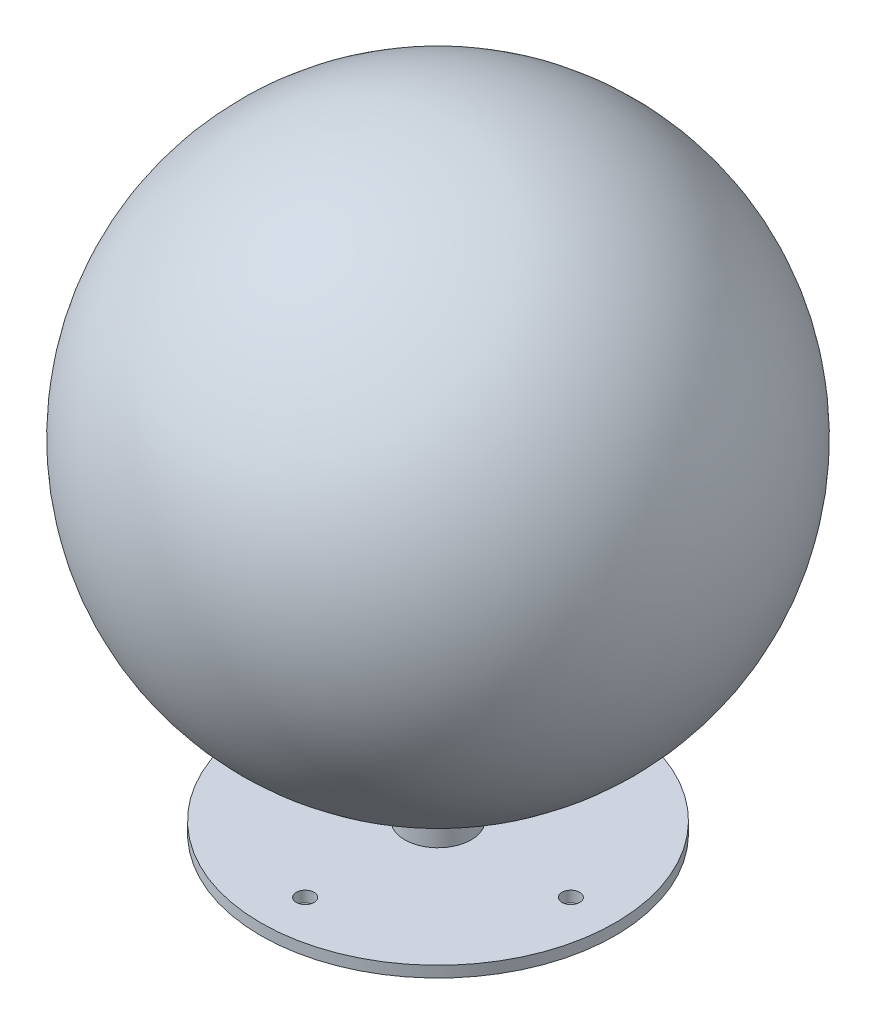
ISO-10303-21;
HEADER;
FILE_DESCRIPTION(('STEP AP214'),'2;1');
FILE_NAME('part.step','',(''),(''),'','','');
FILE_SCHEMA(('AUTOMOTIVE_DESIGN { 1 0 10303 214 1 1 1 1 }'));
ENDSEC;
DATA;
#1=APPLICATION_CONTEXT('core data for automotive mechanical design processes');
#2=APPLICATION_PROTOCOL_DEFINITION('international standard','automotive_design',2000,#1);
#3=PRODUCT_CONTEXT('',#1,'mechanical');
#4=PRODUCT('Part','Part','',(#3));
#5=PRODUCT_RELATED_PRODUCT_CATEGORY('part','',(#4));
#6=PRODUCT_DEFINITION_FORMATION('','',#4);
#7=PRODUCT_DEFINITION_CONTEXT('part definition',#1,'design');
#8=PRODUCT_DEFINITION('design','',#6,#7);
#9=PRODUCT_DEFINITION_SHAPE('','',#8);
#10=(LENGTH_UNIT() NAMED_UNIT(*) SI_UNIT(.MILLI.,.METRE.));
#11=(NAMED_UNIT(*) PLANE_ANGLE_UNIT() SI_UNIT($,.RADIAN.));
#12=(NAMED_UNIT(*) SI_UNIT($,.STERADIAN.) SOLID_ANGLE_UNIT());
#13=UNCERTAINTY_MEASURE_WITH_UNIT(LENGTH_MEASURE(1.E-05),#10,'distance_accuracy_value','');
#14=(GEOMETRIC_REPRESENTATION_CONTEXT(3) GLOBAL_UNCERTAINTY_ASSIGNED_CONTEXT((#13)) GLOBAL_UNIT_ASSIGNED_CONTEXT((#10,
#11,#12)) REPRESENTATION_CONTEXT('',''));
#15=CARTESIAN_POINT('',(0.,0.,0.));
#16=DIRECTION('',(0.,0.,1.));
#17=DIRECTION('',(1.,0.,0.));
#18=AXIS2_PLACEMENT_3D('',#15,#16,#17);
#19=CARTESIAN_POINT('',(0.,5.,0.));
#20=DIRECTION('',(0.,-1.,0.));
#21=DIRECTION('',(0.,0.,-1.));
#22=AXIS2_PLACEMENT_3D('',#19,#20,#21);
#23=CYLINDRICAL_SURFACE('',#22,15.);
#24=CARTESIAN_POINT('',(0.,5.,0.));
#25=DIRECTION('',(0.,1.,0.));
#26=DIRECTION('',(0.,0.,1.));
#27=AXIS2_PLACEMENT_3D('',#24,#25,#26);
#28=CIRCLE('',#27,15.);
#29=CARTESIAN_POINT('',(0.,5.,15.));
#30=VERTEX_POINT('',#29);
#31=EDGE_CURVE('E10',#30,#30,#28,.T.);
#32=ORIENTED_EDGE('',*,*,#31,.T.);
#33=EDGE_LOOP('',(#32));
#34=FACE_BOUND('',#33,.T.);
#35=CARTESIAN_POINT('',(0.,30.9032635400915,0.));
#36=DIRECTION('',(0.,1.,0.));
#37=DIRECTION('',(0.,0.,1.));
#38=AXIS2_PLACEMENT_3D('',#35,#36,#37);
#39=CIRCLE('',#38,15.);
#40=CARTESIAN_POINT('',(0.,30.9032635400915,15.));
#41=VERTEX_POINT('',#40);
#42=EDGE_CURVE('E37',#41,#41,#39,.F.);
#43=ORIENTED_EDGE('',*,*,#42,.T.);
#44=EDGE_LOOP('',(#43));
#45=FACE_BOUND('',#44,.T.);
#46=ADVANCED_FACE('F33',(#34,#45),#23,.T.);
#47=CARTESIAN_POINT('',(0.,5.,0.));
#48=DIRECTION('',(0.,-1.,0.));
#49=DIRECTION('',(0.,0.,-1.));
#50=AXIS2_PLACEMENT_3D('',#47,#48,#49);
#51=CYLINDRICAL_SURFACE('',#50,80.);
#52=CARTESIAN_POINT('',(0.,5.,0.));
#53=DIRECTION('',(0.,1.,0.));
#54=DIRECTION('',(0.,0.,1.));
#55=AXIS2_PLACEMENT_3D('',#52,#53,#54);
#56=CIRCLE('',#55,80.);
#57=CARTESIAN_POINT('',(0.,5.,80.));
#58=VERTEX_POINT('',#57);
#59=EDGE_CURVE('E41',#58,#58,#56,.T.);
#60=ORIENTED_EDGE('',*,*,#59,.F.);
#61=EDGE_LOOP('',(#60));
#62=FACE_BOUND('',#61,.T.);
#63=CARTESIAN_POINT('',(0.,0.,0.));
#64=DIRECTION('',(0.,1.,0.));
#65=DIRECTION('',(0.,0.,1.));
#66=AXIS2_PLACEMENT_3D('',#63,#64,#65);
#67=CIRCLE('',#66,80.);
#68=CARTESIAN_POINT('',(0.,0.,80.));
#69=VERTEX_POINT('',#68);
#70=EDGE_CURVE('E45',#69,#69,#67,.T.);
#71=ORIENTED_EDGE('',*,*,#70,.T.);
#72=EDGE_LOOP('',(#71));
#73=FACE_BOUND('',#72,.T.);
#74=ADVANCED_FACE('F35',(#62,#73),#51,.T.);
#75=CARTESIAN_POINT('',(0.,5.,0.));
#76=DIRECTION('',(0.,1.,0.));
#77=DIRECTION('',(0.,0.,1.));
#78=AXIS2_PLACEMENT_3D('',#75,#76,#77);
#79=PLANE('',#78);
#80=ORIENTED_EDGE('',*,*,#31,.F.);
#81=EDGE_LOOP('',(#80));
#82=FACE_BOUND('',#81,.T.);
#83=CARTESIAN_POINT('',(0.,5.,-60.));
#84=DIRECTION('',(0.,1.,0.));
#85=DIRECTION('',(0.,0.,1.));
#86=AXIS2_PLACEMENT_3D('',#83,#84,#85);
#87=CIRCLE('',#86,3.99999999999999);
#88=CARTESIAN_POINT('',(0.,5.,-56.));
#89=VERTEX_POINT('',#88);
#90=EDGE_CURVE('E52',#89,#89,#87,.T.);
#91=ORIENTED_EDGE('',*,*,#90,.F.);
#92=EDGE_LOOP('',(#91));
#93=FACE_BOUND('',#92,.T.);
#94=CARTESIAN_POINT('',(-60.,5.,0.));
#95=DIRECTION('',(0.,1.,0.));
#96=DIRECTION('',(0.,0.,1.));
#97=AXIS2_PLACEMENT_3D('',#94,#95,#96);
#98=CIRCLE('',#97,3.99999999999999);
#99=CARTESIAN_POINT('',(-60.,5.,3.99999999999999));
#100=VERTEX_POINT('',#99);
#101=EDGE_CURVE('E51',#100,#100,#98,.T.);
#102=ORIENTED_EDGE('',*,*,#101,.F.);
#103=EDGE_LOOP('',(#102));
#104=FACE_BOUND('',#103,.T.);
#105=CARTESIAN_POINT('',(60.,5.,0.));
#106=DIRECTION('',(0.,1.,0.));
#107=DIRECTION('',(0.,0.,1.));
#108=AXIS2_PLACEMENT_3D('',#105,#106,#107);
#109=CIRCLE('',#108,3.99999999999999);
#110=CARTESIAN_POINT('',(60.,5.,3.99999999999999));
#111=VERTEX_POINT('',#110);
#112=EDGE_CURVE('E56',#111,#111,#109,.T.);
#113=ORIENTED_EDGE('',*,*,#112,.F.);
#114=EDGE_LOOP('',(#113));
#115=FACE_BOUND('',#114,.T.);
#116=CARTESIAN_POINT('',(0.,5.,60.));
#117=DIRECTION('',(0.,1.,0.));
#118=DIRECTION('',(0.,0.,1.));
#119=AXIS2_PLACEMENT_3D('',#116,#117,#118);
#120=CIRCLE('',#119,3.99999999999999);
#121=CARTESIAN_POINT('',(0.,5.,64.));
#122=VERTEX_POINT('',#121);
#123=EDGE_CURVE('E62',#122,#122,#120,.T.);
#124=ORIENTED_EDGE('',*,*,#123,.F.);
#125=EDGE_LOOP('',(#124));
#126=FACE_BOUND('',#125,.T.);
#127=ORIENTED_EDGE('',*,*,#59,.T.);
#128=EDGE_LOOP('',(#127));
#129=FACE_BOUND('',#128,.T.);
#130=ADVANCED_FACE('F95',(#82,#93,#104,#115,#126,#129),#79,.T.);
#131=CARTESIAN_POINT('',(0.,0.,0.));
#132=DIRECTION('',(0.,1.,0.));
#133=DIRECTION('',(0.,0.,1.));
#134=AXIS2_PLACEMENT_3D('',#131,#132,#133);
#135=PLANE('',#134);
#136=CARTESIAN_POINT('',(0.,0.,-60.));
#137=DIRECTION('',(0.,1.,0.));
#138=DIRECTION('',(0.,0.,1.));
#139=AXIS2_PLACEMENT_3D('',#136,#137,#138);
#140=CIRCLE('',#139,3.99999999999999);
#141=CARTESIAN_POINT('',(0.,0.,-56.));
#142=VERTEX_POINT('',#141);
#143=EDGE_CURVE('E48',#142,#142,#140,.T.);
#144=ORIENTED_EDGE('',*,*,#143,.T.);
#145=EDGE_LOOP('',(#144));
#146=FACE_BOUND('',#145,.T.);
#147=CARTESIAN_POINT('',(-60.,0.,0.));
#148=DIRECTION('',(0.,1.,0.));
#149=DIRECTION('',(0.,0.,1.));
#150=AXIS2_PLACEMENT_3D('',#147,#148,#149);
#151=CIRCLE('',#150,3.99999999999999);
#152=CARTESIAN_POINT('',(-60.,0.,3.99999999999999));
#153=VERTEX_POINT('',#152);
#154=EDGE_CURVE('E53',#153,#153,#151,.T.);
#155=ORIENTED_EDGE('',*,*,#154,.T.);
#156=EDGE_LOOP('',(#155));
#157=FACE_BOUND('',#156,.T.);
#158=CARTESIAN_POINT('',(60.,0.,0.));
#159=DIRECTION('',(0.,1.,0.));
#160=DIRECTION('',(0.,0.,1.));
#161=AXIS2_PLACEMENT_3D('',#158,#159,#160);
#162=CIRCLE('',#161,3.99999999999999);
#163=CARTESIAN_POINT('',(60.,0.,3.99999999999999));
#164=VERTEX_POINT('',#163);
#165=EDGE_CURVE('E65',#164,#164,#162,.T.);
#166=ORIENTED_EDGE('',*,*,#165,.T.);
#167=EDGE_LOOP('',(#166));
#168=FACE_BOUND('',#167,.T.);
#169=CARTESIAN_POINT('',(0.,0.,60.));
#170=DIRECTION('',(0.,1.,0.));
#171=DIRECTION('',(0.,0.,1.));
#172=AXIS2_PLACEMENT_3D('',#169,#170,#171);
#173=CIRCLE('',#172,3.99999999999999);
#174=CARTESIAN_POINT('',(0.,0.,64.));
#175=VERTEX_POINT('',#174);
#176=EDGE_CURVE('E58',#175,#175,#173,.T.);
#177=ORIENTED_EDGE('',*,*,#176,.T.);
#178=EDGE_LOOP('',(#177));
#179=FACE_BOUND('',#178,.T.);
#180=ORIENTED_EDGE('',*,*,#70,.F.);
#181=EDGE_LOOP('',(#180));
#182=FACE_BOUND('',#181,.T.);
#183=ADVANCED_FACE('F107',(#146,#157,#168,#179,#182),#135,.F.);
#184=CARTESIAN_POINT('',(0.,5.,60.));
#185=DIRECTION('',(0.,1.,0.));
#186=DIRECTION('',(0.,0.,1.));
#187=AXIS2_PLACEMENT_3D('',#184,#185,#186);
#188=CYLINDRICAL_SURFACE('',#187,3.99999999999999);
#189=ORIENTED_EDGE('',*,*,#123,.T.);
#190=EDGE_LOOP('',(#189));
#191=FACE_BOUND('',#190,.T.);
#192=ORIENTED_EDGE('',*,*,#176,.F.);
#193=EDGE_LOOP('',(#192));
#194=FACE_BOUND('',#193,.T.);
#195=ADVANCED_FACE('F104',(#191,#194),#188,.F.);
#196=CARTESIAN_POINT('',(60.,5.,0.));
#197=DIRECTION('',(0.,1.,0.));
#198=DIRECTION('',(0.,0.,1.));
#199=AXIS2_PLACEMENT_3D('',#196,#197,#198);
#200=CYLINDRICAL_SURFACE('',#199,3.99999999999999);
#201=ORIENTED_EDGE('',*,*,#112,.T.);
#202=EDGE_LOOP('',(#201));
#203=FACE_BOUND('',#202,.T.);
#204=ORIENTED_EDGE('',*,*,#165,.F.);
#205=EDGE_LOOP('',(#204));
#206=FACE_BOUND('',#205,.T.);
#207=ADVANCED_FACE('F100',(#203,#206),#200,.F.);
#208=CARTESIAN_POINT('',(-60.,5.,0.));
#209=DIRECTION('',(0.,1.,0.));
#210=DIRECTION('',(0.,0.,1.));
#211=AXIS2_PLACEMENT_3D('',#208,#209,#210);
#212=CYLINDRICAL_SURFACE('',#211,3.99999999999999);
#213=ORIENTED_EDGE('',*,*,#101,.T.);
#214=EDGE_LOOP('',(#213));
#215=FACE_BOUND('',#214,.T.);
#216=ORIENTED_EDGE('',*,*,#154,.F.);
#217=EDGE_LOOP('',(#216));
#218=FACE_BOUND('',#217,.T.);
#219=ADVANCED_FACE('F86',(#215,#218),#212,.F.);
#220=CARTESIAN_POINT('',(0.,5.,-60.));
#221=DIRECTION('',(0.,1.,0.));
#222=DIRECTION('',(0.,0.,1.));
#223=AXIS2_PLACEMENT_3D('',#220,#221,#222);
#224=CYLINDRICAL_SURFACE('',#223,3.99999999999999);
#225=ORIENTED_EDGE('',*,*,#90,.T.);
#226=EDGE_LOOP('',(#225));
#227=FACE_BOUND('',#226,.T.);
#228=ORIENTED_EDGE('',*,*,#143,.F.);
#229=EDGE_LOOP('',(#228));
#230=FACE_BOUND('',#229,.T.);
#231=ADVANCED_FACE('F81',(#227,#230),#224,.F.);
#232=CARTESIAN_POINT('',(0.,155.,0.));
#233=DIRECTION('',(0.,-1.,0.));
#234=DIRECTION('',(-1.,0.,0.));
#235=AXIS2_PLACEMENT_3D('',#232,#233,#234);
#236=SPHERICAL_SURFACE('',#235,125.);
#237=ORIENTED_EDGE('',*,*,#42,.F.);
#238=EDGE_LOOP('',(#237));
#239=FACE_BOUND('',#238,.T.);
#240=ADVANCED_FACE('F79',(#239),#236,.T.);
#241=CLOSED_SHELL('',(#46,#74,#130,#183,#195,#207,#219,#231,#240));
#242=MANIFOLD_SOLID_BREP('B2',#241);
#243=ADVANCED_BREP_SHAPE_REPRESENTATION('',(#18,#242),#14);
#244=SHAPE_DEFINITION_REPRESENTATION(#9,#243);
ENDSEC;
END-ISO-10303-21;
